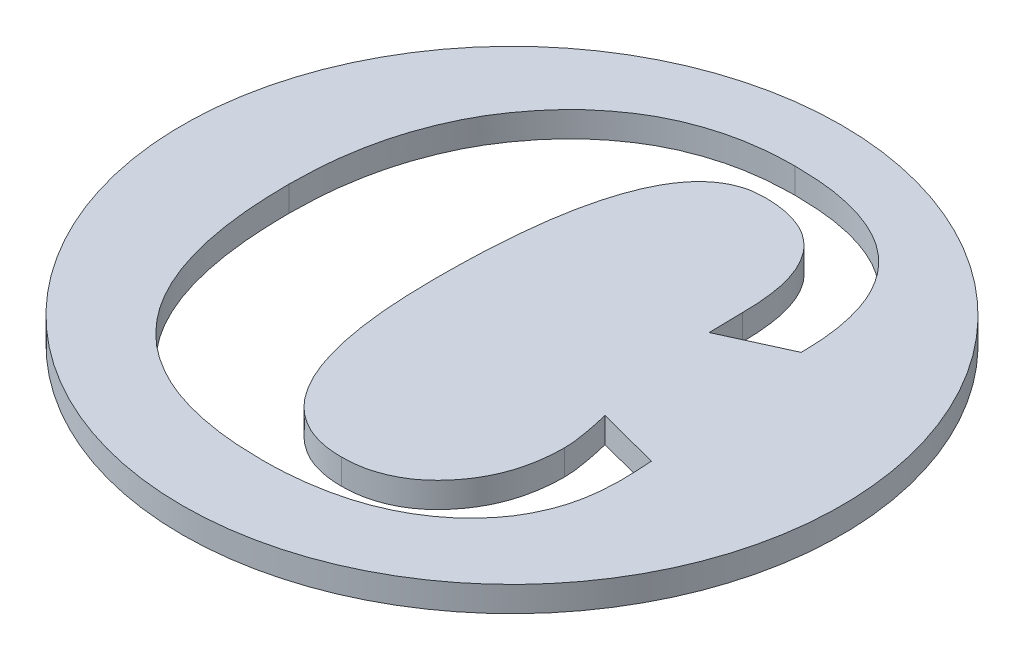
ISO-10303-21;
HEADER;
FILE_DESCRIPTION(('STEP AP214'),'2;1');
FILE_NAME('part.step','',(''),(''),'','','');
FILE_SCHEMA(('AUTOMOTIVE_DESIGN { 1 0 10303 214 1 1 1 1 }'));
ENDSEC;
DATA;
#1=APPLICATION_CONTEXT('core data for automotive mechanical design processes');
#2=APPLICATION_PROTOCOL_DEFINITION('international standard','automotive_design',2000,#1);
#3=PRODUCT_CONTEXT('',#1,'mechanical');
#4=PRODUCT('Part','Part','',(#3));
#5=PRODUCT_RELATED_PRODUCT_CATEGORY('part','',(#4));
#6=PRODUCT_DEFINITION_FORMATION('','',#4);
#7=PRODUCT_DEFINITION_CONTEXT('part definition',#1,'design');
#8=PRODUCT_DEFINITION('design','',#6,#7);
#9=PRODUCT_DEFINITION_SHAPE('','',#8);
#10=(LENGTH_UNIT() NAMED_UNIT(*) SI_UNIT(.MILLI.,.METRE.));
#11=(NAMED_UNIT(*) PLANE_ANGLE_UNIT() SI_UNIT($,.RADIAN.));
#12=(NAMED_UNIT(*) SI_UNIT($,.STERADIAN.) SOLID_ANGLE_UNIT());
#13=UNCERTAINTY_MEASURE_WITH_UNIT(LENGTH_MEASURE(1.E-05),#10,'distance_accuracy_value','');
#14=(GEOMETRIC_REPRESENTATION_CONTEXT(3) GLOBAL_UNCERTAINTY_ASSIGNED_CONTEXT((#13)) GLOBAL_UNIT_ASSIGNED_CONTEXT((#10,
#11,#12)) REPRESENTATION_CONTEXT('',''));
#15=CARTESIAN_POINT('',(0.,0.,0.));
#16=DIRECTION('',(0.,0.,1.));
#17=DIRECTION('',(1.,0.,0.));
#18=AXIS2_PLACEMENT_3D('',#15,#16,#17);
#19=CARTESIAN_POINT('',(0.,1.,0.));
#20=DIRECTION('',(0.,1.,0.));
#21=DIRECTION('',(0.,0.,1.));
#22=AXIS2_PLACEMENT_3D('',#19,#20,#21);
#23=PLANE('',#22);
#24=CARTESIAN_POINT('',(0.,1.,0.));
#25=DIRECTION('',(0.,1.,0.));
#26=DIRECTION('',(0.,0.,1.));
#27=AXIS2_PLACEMENT_3D('',#24,#25,#26);
#28=CIRCLE('',#27,13.);
#29=CARTESIAN_POINT('',(0.,1.,13.));
#30=VERTEX_POINT('',#29);
#31=EDGE_CURVE('E11',#30,#30,#28,.T.);
#32=ORIENTED_EDGE('',*,*,#31,.T.);
#33=EDGE_LOOP('',(#32));
#34=FACE_BOUND('',#33,.T.);
#35=CARTESIAN_POINT('',(1.476351583732,1.,8.20375611107367));
#36=CARTESIAN_POINT('',(1.61974551017424,1.,8.19917995660554));
#37=CARTESIAN_POINT('',(1.9020487574601,1.,8.19017076564127));
#38=CARTESIAN_POINT('',(2.31664097278782,1.,8.13115632994052));
#39=CARTESIAN_POINT('',(2.70988021241242,1.,8.0194669779392));
#40=CARTESIAN_POINT('',(3.08534632281107,1.,7.87167643885167));
#41=CARTESIAN_POINT('',(3.44425119432093,1.,7.68397991437655));
#42=CARTESIAN_POINT('',(3.78417604407388,1.,7.45318836241749));
#43=CARTESIAN_POINT('',(4.10274482596875,1.,7.1762131296289));
#44=CARTESIAN_POINT('',(4.39916024058578,1.,6.86090175100949));
#45=CARTESIAN_POINT('',(4.67131082176551,1.,6.51563360946859));
#46=CARTESIAN_POINT('',(4.91197305731182,1.,6.1463094007475));
#47=CARTESIAN_POINT('',(5.11132313200068,1.,5.75245186517567));
#48=CARTESIAN_POINT('',(5.27722941669169,1.,5.34048501519983));
#49=CARTESIAN_POINT('',(5.40292855332015,1.,4.90682129685313));
#50=CARTESIAN_POINT('',(5.49323947888048,1.,4.45383328502686));
#51=CARTESIAN_POINT('',(5.55227374370055,1.,3.9793255792857));
#52=CARTESIAN_POINT('',(5.55775813052687,1.,3.65532503641552));
#53=CARTESIAN_POINT('',(5.56055297262089,1.,3.49021444440701));
#54=B_SPLINE_CURVE_WITH_KNOTS('',3,(#35,#36,#37,#38,#39,#40,#41,#42,#43,#44,#45,#46,#47,#48,#49,
#50,#51,#52,#53),.UNSPECIFIED.,.F.,.F.,(4,1,1,1,1,1,1,1,1,1,1,1,1,1,1,1,4),(0.,
0.0617851155678099,0.121637918644697,0.179858723011441,0.237499434056786,0.29521087199379,
0.353989525029223,0.414091709118384,0.476701328925948,0.540170659932453,0.603274736539273,
0.666274065790541,0.730048715718103,0.794348143901258,0.860479406808787,0.928900342156493,1.),.UNSPECIFIED.);
#55=CARTESIAN_POINT('',(1.476351583732,1.,8.20375611107367));
#56=VERTEX_POINT('',#55);
#57=CARTESIAN_POINT('',(5.56055297262089,1.,3.49021444440701));
#58=VERTEX_POINT('',#57);
#59=EDGE_CURVE('E150',#56,#58,#54,.T.);
#60=ORIENTED_EDGE('',*,*,#59,.T.);
#61=CARTESIAN_POINT('',(5.56055297262089,1.,3.49021444440701));
#62=CARTESIAN_POINT('',(5.55709815481784,1.,3.36993002924337));
#63=CARTESIAN_POINT('',(5.54940400599004,1.,3.10204725084729));
#64=CARTESIAN_POINT('',(5.4792830655672,1.,2.66399498626251));
#65=CARTESIAN_POINT('',(5.3867625300742,1.,2.14790403311302));
#66=CARTESIAN_POINT('',(5.29925141659086,1.,1.78119062246025));
#67=CARTESIAN_POINT('',(5.25239325039867,1.,1.58483249996256));
#68=B_SPLINE_CURVE_WITH_KNOTS('',3,(#61,#62,#63,#64,#65,#66,#67),.UNSPECIFIED.,.F.,.F.,(4,1,1,1,
4),(0.,0.186495746762368,0.415340580355206,0.686941839029872,1.),.UNSPECIFIED.);
#69=CARTESIAN_POINT('',(5.25239325039867,1.,1.58483249996256));
#70=VERTEX_POINT('',#69);
#71=EDGE_CURVE('E60',#58,#70,#68,.T.);
#72=ORIENTED_EDGE('',*,*,#71,.T.);
#73=DIRECTION('',(0.967599274507933,0.,0.252490878987184));
#74=VECTOR('',#73,1.);
#75=CARTESIAN_POINT('',(5.25239325039867,1.,1.58483249996256));
#76=LINE('',#75,#74);
#77=CARTESIAN_POINT('',(7.73069186150978,1.,2.23153388885145));
#78=VERTEX_POINT('',#77);
#79=EDGE_CURVE('E156',#70,#78,#76,.T.);
#80=ORIENTED_EDGE('',*,*,#79,.T.);
#81=CARTESIAN_POINT('',(7.73069186150978,1.,2.23153388885145));
#82=CARTESIAN_POINT('',(7.74585490657577,1.,2.4658262893749));
#83=CARTESIAN_POINT('',(7.77401121265576,1.,2.9008845848985));
#84=CARTESIAN_POINT('',(7.78000790672506,1.,3.33679731153401));
#85=CARTESIAN_POINT('',(7.78277519484312,1.,3.53795749996256));
#86=B_SPLINE_CURVE_WITH_KNOTS('',3,(#81,#82,#83,#84,#85),.UNSPECIFIED.,.F.,.F.,(4,1,4),(0.,
0.538531049595257,1.),.UNSPECIFIED.);
#87=CARTESIAN_POINT('',(7.78277519484312,1.,3.53795749996256));
#88=VERTEX_POINT('',#87);
#89=EDGE_CURVE('E449',#78,#88,#86,.T.);
#90=ORIENTED_EDGE('',*,*,#89,.T.);
#91=CARTESIAN_POINT('',(7.78277519484312,1.,3.53795749996256));
#92=CARTESIAN_POINT('',(7.77573444059267,1.,3.77266628622254));
#93=CARTESIAN_POINT('',(7.76198387034077,1.,4.23105178575869));
#94=CARTESIAN_POINT('',(7.66510678884162,1.,4.90210786273724));
#95=CARTESIAN_POINT('',(7.50353480451613,1.,5.53719048035674));
#96=CARTESIAN_POINT('',(7.26250637559995,1.,6.13254791976599));
#97=CARTESIAN_POINT('',(6.97017174919938,1.,6.69734956114906));
#98=CARTESIAN_POINT('',(6.5999185256151,1.,7.22061254440377));
#99=CARTESIAN_POINT('',(6.1672949171714,1.,7.70906904669273));
#100=CARTESIAN_POINT('',(5.67348497863925,1.,8.15992995783578));
#101=CARTESIAN_POINT('',(5.12158984255351,1.,8.56126615780749));
#102=CARTESIAN_POINT('',(4.52533096122255,1.,8.91531599675034));
#103=CARTESIAN_POINT('',(3.88158818988202,1.,9.21066233173507));
#104=CARTESIAN_POINT('',(3.19477189575157,1.,9.45421056740481));
#105=CARTESIAN_POINT('',(2.46195738161705,1.,9.63922879305538));
#106=CARTESIAN_POINT('',(1.68571672581894,1.,9.77267979880114));
#107=CARTESIAN_POINT('',(0.864809488403498,1.,9.85751753878493));
#108=CARTESIAN_POINT('',(0.301796476434666,1.,9.86605419536471));
#109=CARTESIAN_POINT('',(0.0136779726208919,1.,9.87042277774034));
#110=B_SPLINE_CURVE_WITH_KNOTS('',3,(#91,#92,#93,#94,#95,#96,#97,#98,#99,#100,#101,#102,#103,
#104,#105,#106,#107,#108,#109),.UNSPECIFIED.,.F.,.F.,(4,1,1,1,1,1,1,1,1,1,1,1,1,1,1,1,4),(0.,
0.0623989737755393,0.121864993724444,0.179903958777674,0.236197963863891,0.292298398272552,
0.348650213583212,0.406157610571756,0.465522746645016,0.526080067762016,0.587308216080481,
0.649618181508208,0.714107337130903,0.780822094024443,0.850331226324203,0.923407910257143,1.),.UNSPECIFIED.);
#111=CARTESIAN_POINT('',(0.0136779726208919,1.,9.87042277774034));
#112=VERTEX_POINT('',#111);
#113=EDGE_CURVE('E304',#88,#112,#110,.T.);
#114=ORIENTED_EDGE('',*,*,#113,.T.);
#115=CARTESIAN_POINT('',(0.0136779726208919,1.,9.87042277774034));
#116=CARTESIAN_POINT('',(-0.345453387098413,1.,9.86340549300091));
#117=CARTESIAN_POINT('',(-1.04259134345381,1.,9.84978369303825));
#118=CARTESIAN_POINT('',(-2.05491348171566,1.,9.73080609763991));
#119=CARTESIAN_POINT('',(-2.99780830363982,1.,9.53736232386836));
#120=CARTESIAN_POINT('',(-3.87425124514682,1.,9.2705035916861));
#121=CARTESIAN_POINT('',(-4.67820190474734,1.,8.91731599317517));
#122=CARTESIAN_POINT('',(-5.41162835389207,1.,8.48501398991042));
#123=CARTESIAN_POINT('',(-6.08026275079366,1.,7.97918786646755));
#124=CARTESIAN_POINT('',(-6.67116569313639,1.,7.38627341142078));
#125=CARTESIAN_POINT('',(-7.20195736860133,1.,6.72419454862214));
#126=CARTESIAN_POINT('',(-7.65374203853512,1.,5.97838426978279));
#127=CARTESIAN_POINT('',(-8.03628823175623,1.,5.15719957824529));
#128=CARTESIAN_POINT('',(-8.34772327204242,1.,4.25802044729199));
#129=CARTESIAN_POINT('',(-8.5894361475008,1.,3.28160554009184));
#130=CARTESIAN_POINT('',(-8.76023183791302,1.,2.2277861781733));
#131=CARTESIAN_POINT('',(-8.865609008698,1.,1.09652957068112));
#132=CARTESIAN_POINT('',(-8.87767049071885,1.,0.316264727978851));
#133=CARTESIAN_POINT('',(-8.88389147182355,1.,-0.0861744444818815));
#134=B_SPLINE_CURVE_WITH_KNOTS('',3,(#115,#116,#117,#118,#119,#120,#121,#122,#123,#124,#125,
#126,#127,#128,#129,#130,#131,#132,#133),.UNSPECIFIED.,.F.,.F.,(4,1,1,1,1,1,1,1,1,1,1,1,1,1,1,1,
4),(0.,0.0703735105460199,0.136607522556516,0.199453052995705,0.258831225595281,
0.315841585200226,0.371139194359229,0.425361107476769,0.479702278503174,0.534795917390444,
0.59130971529807,0.650173734380533,0.71205603322384,0.777532348458583,0.847089228652433,
0.92113282450568,1.),.UNSPECIFIED.);
#135=CARTESIAN_POINT('',(-8.88389147182355,1.,-0.0861744444818815));
#136=VERTEX_POINT('',#135);
#137=EDGE_CURVE('E277',#112,#136,#134,.T.);
#138=ORIENTED_EDGE('',*,*,#137,.T.);
#139=CARTESIAN_POINT('',(-8.88389147182355,1.,-0.0861744444818815));
#140=CARTESIAN_POINT('',(-8.87714444826694,1.,-0.471355807025445));
#141=CARTESIAN_POINT('',(-8.86396985043572,1.,-1.22348146673479));
#142=CARTESIAN_POINT('',(-8.73906225821869,1.,-2.32376159340744));
#143=CARTESIAN_POINT('',(-8.53768384306321,1.,-3.36829728491427));
#144=CARTESIAN_POINT('',(-8.25053483974082,1.,-4.35750155846793));
#145=CARTESIAN_POINT('',(-7.88374944959827,1.,-5.29120772130511));
#146=CARTESIAN_POINT('',(-7.44376054657435,1.,-6.17371661319375));
#147=CARTESIAN_POINT('',(-6.9072499736024,1.,-6.99250141407337));
#148=CARTESIAN_POINT('',(-6.30319477587587,1.,-7.75403753336515));
#149=CARTESIAN_POINT('',(-5.63478291638699,1.,-8.44486956180196));
#150=CARTESIAN_POINT('',(-4.90394363101658,1.,-9.03984127423361));
#151=CARTESIAN_POINT('',(-4.13324793006135,1.,-9.55557000721924));
#152=CARTESIAN_POINT('',(-3.30549478144758,1.,-9.96904201738655));
#153=CARTESIAN_POINT('',(-2.4300734054477,1.,-10.2899490149016));
#154=CARTESIAN_POINT('',(-1.50673339218084,1.,-10.5220510811634));
#155=CARTESIAN_POINT('',(-0.534275430872519,1.,-10.6565894559998));
#156=CARTESIAN_POINT('',(0.130450491509705,1.,-10.6754933270898));
#157=CARTESIAN_POINT('',(0.469407139287559,1.,-10.6851327778152));
#158=B_SPLINE_CURVE_WITH_KNOTS('',3,(#139,#140,#141,#142,#143,#144,#145,#146,#147,#148,#149,
#150,#151,#152,#153,#154,#155,#156,#157),.UNSPECIFIED.,.F.,.F.,(4,1,1,1,1,1,1,1,1,1,1,1,1,1,1,1,
4),(0.,0.0727437462907932,0.14204331644552,0.208885226834343,0.273497230779173,
0.336331460640164,0.39818071815196,0.459435292462066,0.520901698785319,0.581591465620112,
0.640629058614215,0.698619802757939,0.756435090632918,0.814976488526295,0.874437711249095,
0.93597335225051,1.),.UNSPECIFIED.);
#159=CARTESIAN_POINT('',(0.469407139287559,1.,-10.6851327778152));
#160=VERTEX_POINT('',#159);
#161=EDGE_CURVE('E298',#136,#160,#158,.T.);
#162=ORIENTED_EDGE('',*,*,#161,.T.);
#163=CARTESIAN_POINT('',(0.469407139287559,1.,-10.6851327778152));
#164=CARTESIAN_POINT('',(0.731368092849475,1.,-10.6794038379688));
#165=CARTESIAN_POINT('',(1.24032138006633,1.,-10.6682733136389));
#166=CARTESIAN_POINT('',(1.98003141391286,1.,-10.6033765776968));
#167=CARTESIAN_POINT('',(2.66669613432011,1.,-10.4740002553959));
#168=CARTESIAN_POINT('',(3.30540925323153,1.,-10.3097948790739));
#169=CARTESIAN_POINT('',(3.88917370608367,1.,-10.0844430704016));
#170=CARTESIAN_POINT('',(4.42842721089028,1.,-9.82280470880295));
#171=CARTESIAN_POINT('',(4.91458631521047,1.,-9.50212723283302));
#172=CARTESIAN_POINT('',(5.34918139601946,1.,-9.13363315391463));
#173=CARTESIAN_POINT('',(5.73280703664738,1.,-8.71510281180936));
#174=CARTESIAN_POINT('',(6.0623919409979,1.,-8.24712483937377));
#175=CARTESIAN_POINT('',(6.34746987641313,1.,-7.73353644845617));
#176=CARTESIAN_POINT('',(6.57198450790892,1.,-7.16634116199518));
#177=CARTESIAN_POINT('',(6.74845361199093,1.,-6.55267860634565));
#178=CARTESIAN_POINT('',(6.87980413209269,1.,-5.89098287942699));
#179=CARTESIAN_POINT('',(6.9513963250631,1.,-5.18035406448809));
#180=CARTESIAN_POINT('',(6.96156493816125,1.,-4.69136174458433));
#181=CARTESIAN_POINT('',(6.96680297262089,1.,-4.43947305559299));
#182=B_SPLINE_CURVE_WITH_KNOTS('',3,(#163,#164,#165,#166,#167,#168,#169,#170,#171,#172,#173,
#174,#175,#176,#177,#178,#179,#180,#181),.UNSPECIFIED.,.F.,.F.,(4,1,1,1,1,1,1,1,1,1,1,1,1,1,1,1,
4),(0.,0.0760281420044085,0.147711986339933,0.215150695516178,0.278592692250528,
0.338784472070683,0.396423015134186,0.452196742851374,0.507294882137751,0.561374406115134,
0.61647254540151,0.673029194161318,0.731419625616101,0.793065190725774,0.858107975388799,
0.92690888056345,1.),.UNSPECIFIED.);
#183=CARTESIAN_POINT('',(6.96680297262089,1.,-4.43947305559299));
#184=VERTEX_POINT('',#183);
#185=EDGE_CURVE('E291',#160,#184,#182,.T.);
#186=ORIENTED_EDGE('',*,*,#185,.T.);
#187=DIRECTION('',(-0.909714034317323,0.,0.415235325768535));
#188=VECTOR('',#187,1.);
#189=CARTESIAN_POINT('',(6.96680297262089,1.,-4.43947305559299));
#190=LINE('',#189,#188);
#191=CARTESIAN_POINT('',(4.47548352817645,1.,-3.30232027781521));
#192=VERTEX_POINT('',#191);
#193=EDGE_CURVE('E297',#184,#192,#190,.T.);
#194=ORIENTED_EDGE('',*,*,#193,.T.);
#195=CARTESIAN_POINT('',(4.47548352817645,1.,-3.30232027781521));
#196=CARTESIAN_POINT('',(4.47010695179073,1.,-3.43829394401775));
#197=CARTESIAN_POINT('',(4.459927879974,1.,-3.69572276380275));
#198=CARTESIAN_POINT('',(4.46127664689068,1.,-4.05617003361408));
#199=CARTESIAN_POINT('',(4.44714290343167,1.,-4.36850647365915));
#200=CARTESIAN_POINT('',(4.44871535383197,1.,-4.55954312967595));
#201=CARTESIAN_POINT('',(4.44944186150978,1.,-4.64780638892633));
#202=B_SPLINE_CURVE_WITH_KNOTS('',3,(#195,#196,#197,#198,#199,#200,#201),.UNSPECIFIED.,.F.,.F.,
(4,1,1,1,4),(0.,0.303299990034831,0.574215292240264,0.803277827253538,1.),.UNSPECIFIED.);
#203=CARTESIAN_POINT('',(4.44944186150978,1.,-4.64780638892633));
#204=VERTEX_POINT('',#203);
#205=EDGE_CURVE('E322',#192,#204,#202,.T.);
#206=ORIENTED_EDGE('',*,*,#205,.T.);
#207=CARTESIAN_POINT('',(4.44944186150978,1.,-4.64780638892633));
#208=CARTESIAN_POINT('',(4.44772262283551,1.,-4.82444802567546));
#209=CARTESIAN_POINT('',(4.44439120088965,1.,-5.16673198777264));
#210=CARTESIAN_POINT('',(4.39666093289007,1.,-5.66173169544874));
#211=CARTESIAN_POINT('',(4.33746246316867,1.,-6.12593625774083));
#212=CARTESIAN_POINT('',(4.23476625315342,1.,-6.55264925446584));
#213=CARTESIAN_POINT('',(4.11517791793676,1.,-6.94906122059844));
#214=CARTESIAN_POINT('',(3.96437331318962,1.,-7.30869893311226));
#215=CARTESIAN_POINT('',(3.78380149201401,1.,-7.63357581985285));
#216=CARTESIAN_POINT('',(3.58075849632391,1.,-7.92760842416613));
#217=CARTESIAN_POINT('',(3.34464224335166,1.,-8.18494754593441));
#218=CARTESIAN_POINT('',(3.08087720941579,1.,-8.4072471675355));
#219=CARTESIAN_POINT('',(2.79409045538688,1.,-8.60265630077306));
#220=CARTESIAN_POINT('',(2.47264453642369,1.,-8.75121590690004));
#221=CARTESIAN_POINT('',(2.1296029962551,1.,-8.87634501463374));
#222=CARTESIAN_POINT('',(1.75544732373962,1.,-8.95501086174826));
#223=CARTESIAN_POINT('',(1.3564408329853,1.,-9.00963008294383));
#224=CARTESIAN_POINT('',(1.08014363353285,1.,-9.01546671937989));
#225=CARTESIAN_POINT('',(0.938157139287559,1.,-9.01846611114855));
#226=B_SPLINE_CURVE_WITH_KNOTS('',3,(#207,#208,#209,#210,#211,#212,#213,#214,#215,#216,#217,
#218,#219,#220,#221,#222,#223,#224,#225),.UNSPECIFIED.,.F.,.F.,(4,1,1,1,1,1,1,1,1,1,1,1,1,1,1,1,
4),(0.,0.082640455901403,0.160134967021523,0.23263077022362,0.301456649819439,0.365283863273637,
0.426282357066753,0.483570813151731,0.538991790620148,0.593153178552392,0.646478376382466,
0.700193424190971,0.755015418240262,0.811773116378229,0.870753559190315,0.933581487396119,1.),.UNSPECIFIED.);
#227=CARTESIAN_POINT('',(0.938157139287559,1.,-9.01846611114855));
#228=VERTEX_POINT('',#227);
#229=EDGE_CURVE('E328',#204,#228,#226,.T.);
#230=ORIENTED_EDGE('',*,*,#229,.T.);
#231=CARTESIAN_POINT('',(0.938157139287559,1.,-9.01846611114855));
#232=CARTESIAN_POINT('',(0.786942196127863,1.,-9.01267368166421));
#233=CARTESIAN_POINT('',(0.491913679154727,1.,-9.00137233905396));
#234=CARTESIAN_POINT('',(0.0644053175698157,1.,-8.88596345085515));
#235=CARTESIAN_POINT('',(-0.332873883244821,1.,-8.70398518281813));
#236=CARTESIAN_POINT('',(-0.699914649734606,1.,-8.4447011355967));
#237=CARTESIAN_POINT('',(-1.03632974297965,1.,-8.11491449353004));
#238=CARTESIAN_POINT('',(-1.33955244015641,1.,-7.71070614409247));
#239=CARTESIAN_POINT('',(-1.61291755329095,1.,-7.23590628214393));
#240=CARTESIAN_POINT('',(-1.86010983294428,1.,-6.69097094680381));
#241=CARTESIAN_POINT('',(-2.07407479662096,1.,-6.07092311255675));
#242=CARTESIAN_POINT('',(-2.2643959578668,1.,-5.38100179059882));
#243=CARTESIAN_POINT('',(-2.42300299642052,1.,-4.61972046733472));
#244=CARTESIAN_POINT('',(-2.55301875658315,1.,-3.7867717995561));
#245=CARTESIAN_POINT('',(-2.64933898807959,1.,-2.88126335488933));
#246=CARTESIAN_POINT('',(-2.72363513602551,1.,-1.90289272878824));
#247=CARTESIAN_POINT('',(-2.76672262091619,1.,-0.853348431692566));
#248=CARTESIAN_POINT('',(-2.77071900860245,1.,-0.129616857575528));
#249=CARTESIAN_POINT('',(-2.77278036071244,1.,0.243686666629229));
#250=B_SPLINE_CURVE_WITH_KNOTS('',3,(#231,#232,#233,#234,#235,#236,#237,#238,#239,#240,#241,
#242,#243,#244,#245,#246,#247,#248,#249),.UNSPECIFIED.,.F.,.F.,(4,1,1,1,1,1,1,1,1,1,1,1,1,1,1,1,
4),(0.,0.0414846630362758,0.080938817004329,0.120799807823618,0.161071381235725,
0.203821694428608,0.249798770917182,0.299526002644319,0.354165298577634,0.414039729669565,
0.479653235863514,0.550792175808231,0.62768726000104,0.711311729677756,0.801052899868468,
0.897382322030063,1.),.UNSPECIFIED.);
#251=CARTESIAN_POINT('',(-2.77278036071244,1.,0.243686666629229));
#252=VERTEX_POINT('',#251);
#253=EDGE_CURVE('E337',#228,#252,#250,.T.);
#254=ORIENTED_EDGE('',*,*,#253,.T.);
#255=CARTESIAN_POINT('',(-2.77278036071244,1.,0.243686666629229));
#256=CARTESIAN_POINT('',(-2.76923490772143,1.,0.564921798003715));
#257=CARTESIAN_POINT('',(-2.7623634866824,1.,1.18750566691976));
#258=CARTESIAN_POINT('',(-2.71575219882243,1.,2.08977385218027));
#259=CARTESIAN_POINT('',(-2.63433042201164,1.,2.9299578420185));
#260=CARTESIAN_POINT('',(-2.51878013474102,1.,3.70833990062915));
#261=CARTESIAN_POINT('',(-2.36719576508956,1.,4.42568234691635));
#262=CARTESIAN_POINT('',(-2.18616640974484,1.,5.08138104038713));
#263=CARTESIAN_POINT('',(-1.97753695720858,1.,5.67694519080182));
#264=CARTESIAN_POINT('',(-1.72195598277479,1.,6.20495827968991));
#265=CARTESIAN_POINT('',(-1.44292091696902,1.,6.67600247413522));
#266=CARTESIAN_POINT('',(-1.12801036180178,1.,7.08687998950643));
#267=CARTESIAN_POINT('',(-0.775787049027472,1.,7.43224592897431));
#268=CARTESIAN_POINT('',(-0.387635905027499,1.,7.71157805279948));
#269=CARTESIAN_POINT('',(0.0274643201125413,1.,7.94149635018268));
#270=CARTESIAN_POINT('',(0.4838739531805,1.,8.08632805435749));
#271=CARTESIAN_POINT('',(0.968240334249044,1.,8.18985694641954));
#272=CARTESIAN_POINT('',(1.30358628122679,1.,8.19903019054252));
#273=CARTESIAN_POINT('',(1.476351583732,1.,8.20375611107367));
#274=B_SPLINE_CURVE_WITH_KNOTS('',3,(#255,#256,#257,#258,#259,#260,#261,#262,#263,#264,#265,
#266,#267,#268,#269,#270,#271,#272,#273),.UNSPECIFIED.,.F.,.F.,(4,1,1,1,1,1,1,1,1,1,1,1,1,1,1,1,
4),(0.,0.095540818616124,0.185167083808434,0.26861532068226,0.346509269192505,0.419087542840383,
0.486528524424942,0.548730971418735,0.606469014644689,0.660708277800895,0.711316803625382,
0.760002838953964,0.806823910599885,0.853219923207003,0.90043674779268,0.948706475980931,1.),.UNSPECIFIED.);
#275=EDGE_CURVE('E346',#252,#56,#274,.T.);
#276=ORIENTED_EDGE('',*,*,#275,.T.);
#277=EDGE_LOOP('',(#60,#72,#80,#90,#114,#138,#162,#186,#194,#206,#230,#254,#276));
#278=FACE_BOUND('',#277,.T.);
#279=ADVANCED_FACE('F44',(#34,#278),#23,.T.);
#280=CARTESIAN_POINT('',(0.,0.,0.));
#281=DIRECTION('',(0.,1.,0.));
#282=DIRECTION('',(0.,0.,1.));
#283=AXIS2_PLACEMENT_3D('',#280,#281,#282);
#284=PLANE('',#283);
#285=CARTESIAN_POINT('',(0.,0.,0.));
#286=DIRECTION('',(0.,1.,0.));
#287=DIRECTION('',(0.,0.,1.));
#288=AXIS2_PLACEMENT_3D('',#285,#286,#287);
#289=CIRCLE('',#288,13.);
#290=CARTESIAN_POINT('',(0.,0.,13.));
#291=VERTEX_POINT('',#290);
#292=EDGE_CURVE('E48',#291,#291,#289,.T.);
#293=ORIENTED_EDGE('',*,*,#292,.F.);
#294=EDGE_LOOP('',(#293));
#295=FACE_BOUND('',#294,.T.);
#296=CARTESIAN_POINT('',(5.56055297262089,0.,3.49021444440701));
#297=CARTESIAN_POINT('',(5.55709815481784,0.,3.36993002924337));
#298=CARTESIAN_POINT('',(5.54940400599004,0.,3.10204725084729));
#299=CARTESIAN_POINT('',(5.4792830655672,0.,2.66399498626251));
#300=CARTESIAN_POINT('',(5.3867625300742,0.,2.14790403311302));
#301=CARTESIAN_POINT('',(5.29925141659086,0.,1.78119062246025));
#302=CARTESIAN_POINT('',(5.25239325039867,0.,1.58483249996256));
#303=B_SPLINE_CURVE_WITH_KNOTS('',3,(#296,#297,#298,#299,#300,#301,#302),.UNSPECIFIED.,.F.,.F.,
(4,1,1,1,4),(0.,0.186495746762368,0.415340580355206,0.686941839029872,1.),.UNSPECIFIED.);
#304=CARTESIAN_POINT('',(5.56055297262089,0.,3.49021444440701));
#305=VERTEX_POINT('',#304);
#306=CARTESIAN_POINT('',(5.25239325039867,0.,1.58483249996256));
#307=VERTEX_POINT('',#306);
#308=EDGE_CURVE('E140',#305,#307,#303,.T.);
#309=ORIENTED_EDGE('',*,*,#308,.F.);
#310=CARTESIAN_POINT('',(1.476351583732,0.,8.20375611107367));
#311=CARTESIAN_POINT('',(1.61974551017424,0.,8.19917995660554));
#312=CARTESIAN_POINT('',(1.9020487574601,0.,8.19017076564127));
#313=CARTESIAN_POINT('',(2.31664097278782,0.,8.13115632994052));
#314=CARTESIAN_POINT('',(2.70988021241242,0.,8.0194669779392));
#315=CARTESIAN_POINT('',(3.08534632281107,0.,7.87167643885167));
#316=CARTESIAN_POINT('',(3.44425119432093,0.,7.68397991437655));
#317=CARTESIAN_POINT('',(3.78417604407388,0.,7.45318836241749));
#318=CARTESIAN_POINT('',(4.10274482596875,0.,7.1762131296289));
#319=CARTESIAN_POINT('',(4.39916024058578,0.,6.86090175100949));
#320=CARTESIAN_POINT('',(4.67131082176551,0.,6.51563360946859));
#321=CARTESIAN_POINT('',(4.91197305731182,0.,6.1463094007475));
#322=CARTESIAN_POINT('',(5.11132313200068,0.,5.75245186517567));
#323=CARTESIAN_POINT('',(5.27722941669169,0.,5.34048501519983));
#324=CARTESIAN_POINT('',(5.40292855332015,0.,4.90682129685313));
#325=CARTESIAN_POINT('',(5.49323947888048,0.,4.45383328502686));
#326=CARTESIAN_POINT('',(5.55227374370055,0.,3.9793255792857));
#327=CARTESIAN_POINT('',(5.55775813052687,0.,3.65532503641552));
#328=CARTESIAN_POINT('',(5.56055297262089,0.,3.49021444440701));
#329=B_SPLINE_CURVE_WITH_KNOTS('',3,(#310,#311,#312,#313,#314,#315,#316,#317,#318,#319,#320,
#321,#322,#323,#324,#325,#326,#327,#328),.UNSPECIFIED.,.F.,.F.,(4,1,1,1,1,1,1,1,1,1,1,1,1,1,1,1,
4),(0.,0.0617851155678099,0.121637918644697,0.179858723011441,0.237499434056786,
0.29521087199379,0.353989525029223,0.414091709118384,0.476701328925948,0.540170659932453,
0.603274736539273,0.666274065790541,0.730048715718103,0.794348143901258,0.860479406808787,
0.928900342156493,1.),.UNSPECIFIED.);
#330=CARTESIAN_POINT('',(1.476351583732,0.,8.20375611107367));
#331=VERTEX_POINT('',#330);
#332=EDGE_CURVE('E240',#331,#305,#329,.T.);
#333=ORIENTED_EDGE('',*,*,#332,.F.);
#334=CARTESIAN_POINT('',(-2.77278036071244,0.,0.243686666629229));
#335=CARTESIAN_POINT('',(-2.76923490772143,0.,0.564921798003715));
#336=CARTESIAN_POINT('',(-2.7623634866824,0.,1.18750566691976));
#337=CARTESIAN_POINT('',(-2.71575219882243,0.,2.08977385218027));
#338=CARTESIAN_POINT('',(-2.63433042201164,0.,2.9299578420185));
#339=CARTESIAN_POINT('',(-2.51878013474102,0.,3.70833990062915));
#340=CARTESIAN_POINT('',(-2.36719576508956,0.,4.42568234691635));
#341=CARTESIAN_POINT('',(-2.18616640974484,0.,5.08138104038713));
#342=CARTESIAN_POINT('',(-1.97753695720858,0.,5.67694519080182));
#343=CARTESIAN_POINT('',(-1.72195598277479,0.,6.20495827968991));
#344=CARTESIAN_POINT('',(-1.44292091696902,0.,6.67600247413522));
#345=CARTESIAN_POINT('',(-1.12801036180178,0.,7.08687998950643));
#346=CARTESIAN_POINT('',(-0.775787049027472,0.,7.43224592897431));
#347=CARTESIAN_POINT('',(-0.387635905027499,0.,7.71157805279948));
#348=CARTESIAN_POINT('',(0.0274643201125413,0.,7.94149635018268));
#349=CARTESIAN_POINT('',(0.4838739531805,0.,8.08632805435749));
#350=CARTESIAN_POINT('',(0.968240334249044,0.,8.18985694641954));
#351=CARTESIAN_POINT('',(1.30358628122679,0.,8.19903019054252));
#352=CARTESIAN_POINT('',(1.476351583732,0.,8.20375611107367));
#353=B_SPLINE_CURVE_WITH_KNOTS('',3,(#334,#335,#336,#337,#338,#339,#340,#341,#342,#343,#344,
#345,#346,#347,#348,#349,#350,#351,#352),.UNSPECIFIED.,.F.,.F.,(4,1,1,1,1,1,1,1,1,1,1,1,1,1,1,1,
4),(0.,0.095540818616124,0.185167083808434,0.26861532068226,0.346509269192505,0.419087542840383,
0.486528524424942,0.548730971418735,0.606469014644689,0.660708277800895,0.711316803625382,
0.760002838953964,0.806823910599885,0.853219923207003,0.90043674779268,0.948706475980931,1.),.UNSPECIFIED.);
#354=CARTESIAN_POINT('',(-2.77278036071244,0.,0.243686666629229));
#355=VERTEX_POINT('',#354);
#356=EDGE_CURVE('E243',#355,#331,#353,.T.);
#357=ORIENTED_EDGE('',*,*,#356,.F.);
#358=CARTESIAN_POINT('',(0.938157139287559,0.,-9.01846611114855));
#359=CARTESIAN_POINT('',(0.786942196127863,0.,-9.01267368166421));
#360=CARTESIAN_POINT('',(0.491913679154727,0.,-9.00137233905396));
#361=CARTESIAN_POINT('',(0.0644053175698157,0.,-8.88596345085515));
#362=CARTESIAN_POINT('',(-0.332873883244821,0.,-8.70398518281813));
#363=CARTESIAN_POINT('',(-0.699914649734606,0.,-8.4447011355967));
#364=CARTESIAN_POINT('',(-1.03632974297965,0.,-8.11491449353004));
#365=CARTESIAN_POINT('',(-1.33955244015641,0.,-7.71070614409247));
#366=CARTESIAN_POINT('',(-1.61291755329095,0.,-7.23590628214393));
#367=CARTESIAN_POINT('',(-1.86010983294428,0.,-6.69097094680381));
#368=CARTESIAN_POINT('',(-2.07407479662096,0.,-6.07092311255675));
#369=CARTESIAN_POINT('',(-2.2643959578668,0.,-5.38100179059882));
#370=CARTESIAN_POINT('',(-2.42300299642052,0.,-4.61972046733472));
#371=CARTESIAN_POINT('',(-2.55301875658315,0.,-3.7867717995561));
#372=CARTESIAN_POINT('',(-2.64933898807959,0.,-2.88126335488933));
#373=CARTESIAN_POINT('',(-2.72363513602551,0.,-1.90289272878824));
#374=CARTESIAN_POINT('',(-2.76672262091619,0.,-0.853348431692566));
#375=CARTESIAN_POINT('',(-2.77071900860245,0.,-0.129616857575528));
#376=CARTESIAN_POINT('',(-2.77278036071244,0.,0.243686666629229));
#377=B_SPLINE_CURVE_WITH_KNOTS('',3,(#358,#359,#360,#361,#362,#363,#364,#365,#366,#367,#368,
#369,#370,#371,#372,#373,#374,#375,#376),.UNSPECIFIED.,.F.,.F.,(4,1,1,1,1,1,1,1,1,1,1,1,1,1,1,1,
4),(0.,0.0414846630362758,0.080938817004329,0.120799807823618,0.161071381235725,
0.203821694428608,0.249798770917182,0.299526002644319,0.354165298577634,0.414039729669565,
0.479653235863514,0.550792175808231,0.62768726000104,0.711311729677756,0.801052899868468,
0.897382322030063,1.),.UNSPECIFIED.);
#378=CARTESIAN_POINT('',(0.938157139287559,0.,-9.01846611114855));
#379=VERTEX_POINT('',#378);
#380=EDGE_CURVE('E246',#379,#355,#377,.T.);
#381=ORIENTED_EDGE('',*,*,#380,.F.);
#382=CARTESIAN_POINT('',(4.44944186150978,0.,-4.64780638892633));
#383=CARTESIAN_POINT('',(4.44772262283551,0.,-4.82444802567546));
#384=CARTESIAN_POINT('',(4.44439120088965,0.,-5.16673198777264));
#385=CARTESIAN_POINT('',(4.39666093289007,0.,-5.66173169544874));
#386=CARTESIAN_POINT('',(4.33746246316867,0.,-6.12593625774083));
#387=CARTESIAN_POINT('',(4.23476625315342,0.,-6.55264925446584));
#388=CARTESIAN_POINT('',(4.11517791793676,0.,-6.94906122059844));
#389=CARTESIAN_POINT('',(3.96437331318962,0.,-7.30869893311226));
#390=CARTESIAN_POINT('',(3.78380149201401,0.,-7.63357581985285));
#391=CARTESIAN_POINT('',(3.58075849632391,0.,-7.92760842416613));
#392=CARTESIAN_POINT('',(3.34464224335166,0.,-8.18494754593441));
#393=CARTESIAN_POINT('',(3.08087720941579,0.,-8.4072471675355));
#394=CARTESIAN_POINT('',(2.79409045538688,0.,-8.60265630077306));
#395=CARTESIAN_POINT('',(2.47264453642369,0.,-8.75121590690004));
#396=CARTESIAN_POINT('',(2.1296029962551,0.,-8.87634501463374));
#397=CARTESIAN_POINT('',(1.75544732373962,0.,-8.95501086174826));
#398=CARTESIAN_POINT('',(1.3564408329853,0.,-9.00963008294383));
#399=CARTESIAN_POINT('',(1.08014363353285,0.,-9.01546671937989));
#400=CARTESIAN_POINT('',(0.938157139287559,0.,-9.01846611114855));
#401=B_SPLINE_CURVE_WITH_KNOTS('',3,(#382,#383,#384,#385,#386,#387,#388,#389,#390,#391,#392,
#393,#394,#395,#396,#397,#398,#399,#400),.UNSPECIFIED.,.F.,.F.,(4,1,1,1,1,1,1,1,1,1,1,1,1,1,1,1,
4),(0.,0.082640455901403,0.160134967021523,0.23263077022362,0.301456649819439,0.365283863273637,
0.426282357066753,0.483570813151731,0.538991790620148,0.593153178552392,0.646478376382466,
0.700193424190971,0.755015418240262,0.811773116378229,0.870753559190315,0.933581487396119,1.),.UNSPECIFIED.);
#402=CARTESIAN_POINT('',(4.44944186150978,0.,-4.64780638892633));
#403=VERTEX_POINT('',#402);
#404=EDGE_CURVE('E249',#403,#379,#401,.T.);
#405=ORIENTED_EDGE('',*,*,#404,.F.);
#406=CARTESIAN_POINT('',(4.47548352817645,0.,-3.30232027781521));
#407=CARTESIAN_POINT('',(4.47010695179073,0.,-3.43829394401775));
#408=CARTESIAN_POINT('',(4.459927879974,0.,-3.69572276380275));
#409=CARTESIAN_POINT('',(4.46127664689068,0.,-4.05617003361408));
#410=CARTESIAN_POINT('',(4.44714290343167,0.,-4.36850647365915));
#411=CARTESIAN_POINT('',(4.44871535383197,0.,-4.55954312967595));
#412=CARTESIAN_POINT('',(4.44944186150978,0.,-4.64780638892633));
#413=B_SPLINE_CURVE_WITH_KNOTS('',3,(#406,#407,#408,#409,#410,#411,#412),.UNSPECIFIED.,.F.,.F.,
(4,1,1,1,4),(0.,0.303299990034831,0.574215292240264,0.803277827253538,1.),.UNSPECIFIED.);
#414=CARTESIAN_POINT('',(4.47548352817645,0.,-3.30232027781521));
#415=VERTEX_POINT('',#414);
#416=EDGE_CURVE('E252',#415,#403,#413,.T.);
#417=ORIENTED_EDGE('',*,*,#416,.F.);
#418=DIRECTION('',(-0.909714034317323,0.,0.415235325768535));
#419=VECTOR('',#418,1.);
#420=CARTESIAN_POINT('',(6.96680297262089,0.,-4.43947305559299));
#421=LINE('',#420,#419);
#422=CARTESIAN_POINT('',(6.96680297262089,0.,-4.43947305559299));
#423=VERTEX_POINT('',#422);
#424=EDGE_CURVE('E255',#423,#415,#421,.T.);
#425=ORIENTED_EDGE('',*,*,#424,.F.);
#426=CARTESIAN_POINT('',(0.469407139287559,0.,-10.6851327778152));
#427=CARTESIAN_POINT('',(0.731368092849475,0.,-10.6794038379688));
#428=CARTESIAN_POINT('',(1.24032138006633,0.,-10.6682733136389));
#429=CARTESIAN_POINT('',(1.98003141391286,0.,-10.6033765776968));
#430=CARTESIAN_POINT('',(2.66669613432011,0.,-10.4740002553959));
#431=CARTESIAN_POINT('',(3.30540925323153,0.,-10.3097948790739));
#432=CARTESIAN_POINT('',(3.88917370608367,0.,-10.0844430704016));
#433=CARTESIAN_POINT('',(4.42842721089028,0.,-9.82280470880295));
#434=CARTESIAN_POINT('',(4.91458631521047,0.,-9.50212723283302));
#435=CARTESIAN_POINT('',(5.34918139601946,0.,-9.13363315391463));
#436=CARTESIAN_POINT('',(5.73280703664738,0.,-8.71510281180936));
#437=CARTESIAN_POINT('',(6.0623919409979,0.,-8.24712483937377));
#438=CARTESIAN_POINT('',(6.34746987641313,0.,-7.73353644845617));
#439=CARTESIAN_POINT('',(6.57198450790892,0.,-7.16634116199518));
#440=CARTESIAN_POINT('',(6.74845361199093,0.,-6.55267860634565));
#441=CARTESIAN_POINT('',(6.87980413209269,0.,-5.89098287942699));
#442=CARTESIAN_POINT('',(6.9513963250631,0.,-5.18035406448809));
#443=CARTESIAN_POINT('',(6.96156493816125,0.,-4.69136174458433));
#444=CARTESIAN_POINT('',(6.96680297262089,0.,-4.43947305559299));
#445=B_SPLINE_CURVE_WITH_KNOTS('',3,(#426,#427,#428,#429,#430,#431,#432,#433,#434,#435,#436,
#437,#438,#439,#440,#441,#442,#443,#444),.UNSPECIFIED.,.F.,.F.,(4,1,1,1,1,1,1,1,1,1,1,1,1,1,1,1,
4),(0.,0.0760281420044085,0.147711986339933,0.215150695516178,0.278592692250528,
0.338784472070683,0.396423015134186,0.452196742851374,0.507294882137751,0.561374406115134,
0.61647254540151,0.673029194161318,0.731419625616101,0.793065190725774,0.858107975388799,
0.92690888056345,1.),.UNSPECIFIED.);
#446=CARTESIAN_POINT('',(0.469407139287559,0.,-10.6851327778152));
#447=VERTEX_POINT('',#446);
#448=EDGE_CURVE('E258',#447,#423,#445,.T.);
#449=ORIENTED_EDGE('',*,*,#448,.F.);
#450=CARTESIAN_POINT('',(-8.88389147182355,0.,-0.0861744444818815));
#451=CARTESIAN_POINT('',(-8.87714444826694,0.,-0.471355807025445));
#452=CARTESIAN_POINT('',(-8.86396985043572,0.,-1.22348146673479));
#453=CARTESIAN_POINT('',(-8.73906225821869,0.,-2.32376159340744));
#454=CARTESIAN_POINT('',(-8.53768384306321,0.,-3.36829728491427));
#455=CARTESIAN_POINT('',(-8.25053483974082,0.,-4.35750155846793));
#456=CARTESIAN_POINT('',(-7.88374944959827,0.,-5.29120772130511));
#457=CARTESIAN_POINT('',(-7.44376054657435,0.,-6.17371661319375));
#458=CARTESIAN_POINT('',(-6.9072499736024,0.,-6.99250141407337));
#459=CARTESIAN_POINT('',(-6.30319477587587,0.,-7.75403753336515));
#460=CARTESIAN_POINT('',(-5.63478291638699,0.,-8.44486956180196));
#461=CARTESIAN_POINT('',(-4.90394363101658,0.,-9.03984127423361));
#462=CARTESIAN_POINT('',(-4.13324793006135,0.,-9.55557000721924));
#463=CARTESIAN_POINT('',(-3.30549478144758,0.,-9.96904201738655));
#464=CARTESIAN_POINT('',(-2.4300734054477,0.,-10.2899490149016));
#465=CARTESIAN_POINT('',(-1.50673339218084,0.,-10.5220510811634));
#466=CARTESIAN_POINT('',(-0.534275430872519,0.,-10.6565894559998));
#467=CARTESIAN_POINT('',(0.130450491509705,0.,-10.6754933270898));
#468=CARTESIAN_POINT('',(0.469407139287559,0.,-10.6851327778152));
#469=B_SPLINE_CURVE_WITH_KNOTS('',3,(#450,#451,#452,#453,#454,#455,#456,#457,#458,#459,#460,
#461,#462,#463,#464,#465,#466,#467,#468),.UNSPECIFIED.,.F.,.F.,(4,1,1,1,1,1,1,1,1,1,1,1,1,1,1,1,
4),(0.,0.0727437462907932,0.14204331644552,0.208885226834343,0.273497230779173,
0.336331460640164,0.39818071815196,0.459435292462066,0.520901698785319,0.581591465620112,
0.640629058614215,0.698619802757939,0.756435090632918,0.814976488526295,0.874437711249095,
0.93597335225051,1.),.UNSPECIFIED.);
#470=CARTESIAN_POINT('',(-8.88389147182355,0.,-0.0861744444818815));
#471=VERTEX_POINT('',#470);
#472=EDGE_CURVE('E261',#471,#447,#469,.T.);
#473=ORIENTED_EDGE('',*,*,#472,.F.);
#474=CARTESIAN_POINT('',(0.0136779726208919,0.,9.87042277774034));
#475=CARTESIAN_POINT('',(-0.345453387098413,0.,9.86340549300091));
#476=CARTESIAN_POINT('',(-1.04259134345381,0.,9.84978369303825));
#477=CARTESIAN_POINT('',(-2.05491348171566,0.,9.73080609763991));
#478=CARTESIAN_POINT('',(-2.99780830363982,0.,9.53736232386836));
#479=CARTESIAN_POINT('',(-3.87425124514682,0.,9.2705035916861));
#480=CARTESIAN_POINT('',(-4.67820190474734,0.,8.91731599317517));
#481=CARTESIAN_POINT('',(-5.41162835389207,0.,8.48501398991042));
#482=CARTESIAN_POINT('',(-6.08026275079366,0.,7.97918786646755));
#483=CARTESIAN_POINT('',(-6.67116569313639,0.,7.38627341142078));
#484=CARTESIAN_POINT('',(-7.20195736860133,0.,6.72419454862214));
#485=CARTESIAN_POINT('',(-7.65374203853512,0.,5.97838426978279));
#486=CARTESIAN_POINT('',(-8.03628823175623,0.,5.15719957824529));
#487=CARTESIAN_POINT('',(-8.34772327204242,0.,4.25802044729199));
#488=CARTESIAN_POINT('',(-8.5894361475008,0.,3.28160554009184));
#489=CARTESIAN_POINT('',(-8.76023183791302,0.,2.2277861781733));
#490=CARTESIAN_POINT('',(-8.865609008698,0.,1.09652957068112));
#491=CARTESIAN_POINT('',(-8.87767049071885,0.,0.316264727978851));
#492=CARTESIAN_POINT('',(-8.88389147182355,0.,-0.0861744444818815));
#493=B_SPLINE_CURVE_WITH_KNOTS('',3,(#474,#475,#476,#477,#478,#479,#480,#481,#482,#483,#484,
#485,#486,#487,#488,#489,#490,#491,#492),.UNSPECIFIED.,.F.,.F.,(4,1,1,1,1,1,1,1,1,1,1,1,1,1,1,1,
4),(0.,0.0703735105460199,0.136607522556516,0.199453052995705,0.258831225595281,
0.315841585200226,0.371139194359229,0.425361107476769,0.479702278503174,0.534795917390444,
0.59130971529807,0.650173734380533,0.71205603322384,0.777532348458583,0.847089228652433,
0.92113282450568,1.),.UNSPECIFIED.);
#494=CARTESIAN_POINT('',(0.0136779726208919,0.,9.87042277774034));
#495=VERTEX_POINT('',#494);
#496=EDGE_CURVE('E264',#495,#471,#493,.T.);
#497=ORIENTED_EDGE('',*,*,#496,.F.);
#498=CARTESIAN_POINT('',(7.78277519484312,0.,3.53795749996256));
#499=CARTESIAN_POINT('',(7.77573444059267,0.,3.77266628622254));
#500=CARTESIAN_POINT('',(7.76198387034077,0.,4.23105178575869));
#501=CARTESIAN_POINT('',(7.66510678884162,0.,4.90210786273724));
#502=CARTESIAN_POINT('',(7.50353480451613,0.,5.53719048035674));
#503=CARTESIAN_POINT('',(7.26250637559995,0.,6.13254791976599));
#504=CARTESIAN_POINT('',(6.97017174919938,0.,6.69734956114906));
#505=CARTESIAN_POINT('',(6.5999185256151,0.,7.22061254440377));
#506=CARTESIAN_POINT('',(6.1672949171714,0.,7.70906904669273));
#507=CARTESIAN_POINT('',(5.67348497863925,0.,8.15992995783578));
#508=CARTESIAN_POINT('',(5.12158984255351,0.,8.56126615780749));
#509=CARTESIAN_POINT('',(4.52533096122255,0.,8.91531599675034));
#510=CARTESIAN_POINT('',(3.88158818988202,0.,9.21066233173507));
#511=CARTESIAN_POINT('',(3.19477189575157,0.,9.45421056740481));
#512=CARTESIAN_POINT('',(2.46195738161705,0.,9.63922879305538));
#513=CARTESIAN_POINT('',(1.68571672581894,0.,9.77267979880114));
#514=CARTESIAN_POINT('',(0.864809488403498,0.,9.85751753878493));
#515=CARTESIAN_POINT('',(0.301796476434666,0.,9.86605419536471));
#516=CARTESIAN_POINT('',(0.0136779726208919,0.,9.87042277774034));
#517=B_SPLINE_CURVE_WITH_KNOTS('',3,(#498,#499,#500,#501,#502,#503,#504,#505,#506,#507,#508,
#509,#510,#511,#512,#513,#514,#515,#516),.UNSPECIFIED.,.F.,.F.,(4,1,1,1,1,1,1,1,1,1,1,1,1,1,1,1,
4),(0.,0.0623989737755393,0.121864993724444,0.179903958777674,0.236197963863891,
0.292298398272552,0.348650213583212,0.406157610571756,0.465522746645016,0.526080067762016,
0.587308216080481,0.649618181508208,0.714107337130903,0.780822094024443,0.850331226324203,
0.923407910257143,1.),.UNSPECIFIED.);
#518=CARTESIAN_POINT('',(7.78277519484312,0.,3.53795749996256));
#519=VERTEX_POINT('',#518);
#520=EDGE_CURVE('E167',#519,#495,#517,.T.);
#521=ORIENTED_EDGE('',*,*,#520,.F.);
#522=CARTESIAN_POINT('',(7.73069186150978,0.,2.23153388885145));
#523=CARTESIAN_POINT('',(7.74585490657577,0.,2.4658262893749));
#524=CARTESIAN_POINT('',(7.77401121265576,0.,2.9008845848985));
#525=CARTESIAN_POINT('',(7.78000790672506,0.,3.33679731153401));
#526=CARTESIAN_POINT('',(7.78277519484312,0.,3.53795749996256));
#527=B_SPLINE_CURVE_WITH_KNOTS('',3,(#522,#523,#524,#525,#526),.UNSPECIFIED.,.F.,.F.,(4,1,4),
(0.,0.538531049595257,1.),.UNSPECIFIED.);
#528=CARTESIAN_POINT('',(7.73069186150978,0.,2.23153388885145));
#529=VERTEX_POINT('',#528);
#530=EDGE_CURVE('E163',#529,#519,#527,.T.);
#531=ORIENTED_EDGE('',*,*,#530,.F.);
#532=DIRECTION('',(0.967599274507933,0.,0.252490878987184));
#533=VECTOR('',#532,1.);
#534=CARTESIAN_POINT('',(5.25239325039867,0.,1.58483249996256));
#535=LINE('',#534,#533);
#536=EDGE_CURVE('E149',#307,#529,#535,.T.);
#537=ORIENTED_EDGE('',*,*,#536,.F.);
#538=EDGE_LOOP('',(#309,#333,#357,#381,#405,#417,#425,#449,#473,#497,#521,#531,#537));
#539=FACE_BOUND('',#538,.T.);
#540=ADVANCED_FACE('F161',(#295,#539),#284,.F.);
#541=CARTESIAN_POINT('',(0.,1.,0.));
#542=DIRECTION('',(0.,-1.,0.));
#543=DIRECTION('',(0.,0.,-1.));
#544=AXIS2_PLACEMENT_3D('',#541,#542,#543);
#545=CYLINDRICAL_SURFACE('',#544,13.);
#546=ORIENTED_EDGE('',*,*,#31,.F.);
#547=EDGE_LOOP('',(#546));
#548=FACE_BOUND('',#547,.T.);
#549=ORIENTED_EDGE('',*,*,#292,.T.);
#550=EDGE_LOOP('',(#549));
#551=FACE_BOUND('',#550,.T.);
#552=ADVANCED_FACE('F46',(#548,#551),#545,.T.);
#553=DIRECTION('',(0.,1.,0.));
#554=VECTOR('',#553,1.);
#555=SURFACE_OF_LINEAR_EXTRUSION('',#303,#554);
#556=ORIENTED_EDGE('',*,*,#71,.F.);
#557=DIRECTION('',(0.,1.,0.));
#558=VECTOR('',#557,1.);
#559=CARTESIAN_POINT('',(5.56055297262089,0.,3.49021444440701));
#560=LINE('',#559,#558);
#561=EDGE_CURVE('E144',#305,#58,#560,.T.);
#562=ORIENTED_EDGE('',*,*,#561,.F.);
#563=ORIENTED_EDGE('',*,*,#308,.T.);
#564=DIRECTION('',(0.,1.,0.));
#565=VECTOR('',#564,1.);
#566=CARTESIAN_POINT('',(5.25239325039867,0.,1.58483249996256));
#567=LINE('',#566,#565);
#568=EDGE_CURVE('E143',#307,#70,#567,.T.);
#569=ORIENTED_EDGE('',*,*,#568,.T.);
#570=EDGE_LOOP('',(#556,#562,#563,#569));
#571=FACE_BOUND('',#570,.T.);
#572=ADVANCED_FACE('F142',(#571),#555,.T.);
#573=CARTESIAN_POINT('',(5.25239325039867,0.,1.58483249996256));
#574=DIRECTION('',(-0.252490878987184,0.,0.967599274507933));
#575=DIRECTION('',(0.967599274507934,0.,0.252490878987184));
#576=AXIS2_PLACEMENT_3D('',#573,#574,#575);
#577=PLANE('',#576);
#578=ORIENTED_EDGE('',*,*,#79,.F.);
#579=ORIENTED_EDGE('',*,*,#568,.F.);
#580=ORIENTED_EDGE('',*,*,#536,.T.);
#581=DIRECTION('',(0.,1.,0.));
#582=VECTOR('',#581,1.);
#583=CARTESIAN_POINT('',(7.73069186150978,0.,2.23153388885145));
#584=LINE('',#583,#582);
#585=EDGE_CURVE('E158',#529,#78,#584,.T.);
#586=ORIENTED_EDGE('',*,*,#585,.T.);
#587=EDGE_LOOP('',(#578,#579,#580,#586));
#588=FACE_BOUND('',#587,.T.);
#589=ADVANCED_FACE('F153',(#588),#577,.T.);
#590=DIRECTION('',(0.,1.,0.));
#591=VECTOR('',#590,1.);
#592=SURFACE_OF_LINEAR_EXTRUSION('',#527,#591);
#593=ORIENTED_EDGE('',*,*,#89,.F.);
#594=ORIENTED_EDGE('',*,*,#585,.F.);
#595=ORIENTED_EDGE('',*,*,#530,.T.);
#596=DIRECTION('',(0.,1.,0.));
#597=VECTOR('',#596,1.);
#598=CARTESIAN_POINT('',(7.78277519484312,0.,3.53795749996256));
#599=LINE('',#598,#597);
#600=EDGE_CURVE('E209',#519,#88,#599,.T.);
#601=ORIENTED_EDGE('',*,*,#600,.T.);
#602=EDGE_LOOP('',(#593,#594,#595,#601));
#603=FACE_BOUND('',#602,.T.);
#604=ADVANCED_FACE('F184',(#603),#592,.T.);
#605=DIRECTION('',(0.,1.,0.));
#606=VECTOR('',#605,1.);
#607=SURFACE_OF_LINEAR_EXTRUSION('',#517,#606);
#608=ORIENTED_EDGE('',*,*,#113,.F.);
#609=ORIENTED_EDGE('',*,*,#600,.F.);
#610=ORIENTED_EDGE('',*,*,#520,.T.);
#611=DIRECTION('',(0.,1.,0.));
#612=VECTOR('',#611,1.);
#613=CARTESIAN_POINT('',(0.0136779726208919,0.,9.87042277774034));
#614=LINE('',#613,#612);
#615=EDGE_CURVE('E212',#495,#112,#614,.T.);
#616=ORIENTED_EDGE('',*,*,#615,.T.);
#617=EDGE_LOOP('',(#608,#609,#610,#616));
#618=FACE_BOUND('',#617,.T.);
#619=ADVANCED_FACE('F188',(#618),#607,.T.);
#620=DIRECTION('',(0.,1.,0.));
#621=VECTOR('',#620,1.);
#622=SURFACE_OF_LINEAR_EXTRUSION('',#493,#621);
#623=ORIENTED_EDGE('',*,*,#137,.F.);
#624=ORIENTED_EDGE('',*,*,#615,.F.);
#625=ORIENTED_EDGE('',*,*,#496,.T.);
#626=DIRECTION('',(0.,1.,0.));
#627=VECTOR('',#626,1.);
#628=CARTESIAN_POINT('',(-8.88389147182355,0.,-0.0861744444818815));
#629=LINE('',#628,#627);
#630=EDGE_CURVE('E215',#471,#136,#629,.T.);
#631=ORIENTED_EDGE('',*,*,#630,.T.);
#632=EDGE_LOOP('',(#623,#624,#625,#631));
#633=FACE_BOUND('',#632,.T.);
#634=ADVANCED_FACE('F274',(#633),#622,.T.);
#635=DIRECTION('',(0.,1.,0.));
#636=VECTOR('',#635,1.);
#637=SURFACE_OF_LINEAR_EXTRUSION('',#469,#636);
#638=ORIENTED_EDGE('',*,*,#161,.F.);
#639=ORIENTED_EDGE('',*,*,#630,.F.);
#640=ORIENTED_EDGE('',*,*,#472,.T.);
#641=DIRECTION('',(0.,1.,0.));
#642=VECTOR('',#641,1.);
#643=CARTESIAN_POINT('',(0.469407139287559,0.,-10.6851327778152));
#644=LINE('',#643,#642);
#645=EDGE_CURVE('E218',#447,#160,#644,.T.);
#646=ORIENTED_EDGE('',*,*,#645,.T.);
#647=EDGE_LOOP('',(#638,#639,#640,#646));
#648=FACE_BOUND('',#647,.T.);
#649=ADVANCED_FACE('F285',(#648),#637,.T.);
#650=DIRECTION('',(0.,1.,0.));
#651=VECTOR('',#650,1.);
#652=SURFACE_OF_LINEAR_EXTRUSION('',#445,#651);
#653=ORIENTED_EDGE('',*,*,#185,.F.);
#654=ORIENTED_EDGE('',*,*,#645,.F.);
#655=ORIENTED_EDGE('',*,*,#448,.T.);
#656=DIRECTION('',(0.,1.,0.));
#657=VECTOR('',#656,1.);
#658=CARTESIAN_POINT('',(6.96680297262089,0.,-4.43947305559299));
#659=LINE('',#658,#657);
#660=EDGE_CURVE('E221',#423,#184,#659,.T.);
#661=ORIENTED_EDGE('',*,*,#660,.T.);
#662=EDGE_LOOP('',(#653,#654,#655,#661));
#663=FACE_BOUND('',#662,.T.);
#664=ADVANCED_FACE('F288',(#663),#652,.T.);
#665=CARTESIAN_POINT('',(6.96680297262089,0.,-4.43947305559299));
#666=DIRECTION('',(-0.415235325768535,0.,-0.909714034317323));
#667=DIRECTION('',(-0.909714034317323,0.,0.415235325768535));
#668=AXIS2_PLACEMENT_3D('',#665,#666,#667);
#669=PLANE('',#668);
#670=ORIENTED_EDGE('',*,*,#193,.F.);
#671=ORIENTED_EDGE('',*,*,#660,.F.);
#672=ORIENTED_EDGE('',*,*,#424,.T.);
#673=DIRECTION('',(0.,1.,0.));
#674=VECTOR('',#673,1.);
#675=CARTESIAN_POINT('',(4.47548352817645,0.,-3.30232027781521));
#676=LINE('',#675,#674);
#677=EDGE_CURVE('E224',#415,#192,#676,.T.);
#678=ORIENTED_EDGE('',*,*,#677,.T.);
#679=EDGE_LOOP('',(#670,#671,#672,#678));
#680=FACE_BOUND('',#679,.T.);
#681=ADVANCED_FACE('F386',(#680),#669,.T.);
#682=DIRECTION('',(0.,1.,0.));
#683=VECTOR('',#682,1.);
#684=SURFACE_OF_LINEAR_EXTRUSION('',#413,#683);
#685=ORIENTED_EDGE('',*,*,#205,.F.);
#686=ORIENTED_EDGE('',*,*,#677,.F.);
#687=ORIENTED_EDGE('',*,*,#416,.T.);
#688=DIRECTION('',(0.,1.,0.));
#689=VECTOR('',#688,1.);
#690=CARTESIAN_POINT('',(4.44944186150978,0.,-4.64780638892633));
#691=LINE('',#690,#689);
#692=EDGE_CURVE('E227',#403,#204,#691,.T.);
#693=ORIENTED_EDGE('',*,*,#692,.T.);
#694=EDGE_LOOP('',(#685,#686,#687,#693));
#695=FACE_BOUND('',#694,.T.);
#696=ADVANCED_FACE('F384',(#695),#684,.T.);
#697=DIRECTION('',(0.,1.,0.));
#698=VECTOR('',#697,1.);
#699=SURFACE_OF_LINEAR_EXTRUSION('',#401,#698);
#700=ORIENTED_EDGE('',*,*,#229,.F.);
#701=ORIENTED_EDGE('',*,*,#692,.F.);
#702=ORIENTED_EDGE('',*,*,#404,.T.);
#703=DIRECTION('',(0.,1.,0.));
#704=VECTOR('',#703,1.);
#705=CARTESIAN_POINT('',(0.938157139287559,0.,-9.01846611114855));
#706=LINE('',#705,#704);
#707=EDGE_CURVE('E230',#379,#228,#706,.T.);
#708=ORIENTED_EDGE('',*,*,#707,.T.);
#709=EDGE_LOOP('',(#700,#701,#702,#708));
#710=FACE_BOUND('',#709,.T.);
#711=ADVANCED_FACE('F378',(#710),#699,.T.);
#712=DIRECTION('',(0.,1.,0.));
#713=VECTOR('',#712,1.);
#714=SURFACE_OF_LINEAR_EXTRUSION('',#377,#713);
#715=ORIENTED_EDGE('',*,*,#253,.F.);
#716=ORIENTED_EDGE('',*,*,#707,.F.);
#717=ORIENTED_EDGE('',*,*,#380,.T.);
#718=DIRECTION('',(0.,1.,0.));
#719=VECTOR('',#718,1.);
#720=CARTESIAN_POINT('',(-2.77278036071244,0.,0.243686666629229));
#721=LINE('',#720,#719);
#722=EDGE_CURVE('E233',#355,#252,#721,.T.);
#723=ORIENTED_EDGE('',*,*,#722,.T.);
#724=EDGE_LOOP('',(#715,#716,#717,#723));
#725=FACE_BOUND('',#724,.T.);
#726=ADVANCED_FACE('F374',(#725),#714,.T.);
#727=DIRECTION('',(0.,1.,0.));
#728=VECTOR('',#727,1.);
#729=SURFACE_OF_LINEAR_EXTRUSION('',#353,#728);
#730=ORIENTED_EDGE('',*,*,#275,.F.);
#731=ORIENTED_EDGE('',*,*,#722,.F.);
#732=ORIENTED_EDGE('',*,*,#356,.T.);
#733=DIRECTION('',(0.,1.,0.));
#734=VECTOR('',#733,1.);
#735=CARTESIAN_POINT('',(1.476351583732,0.,8.20375611107367));
#736=LINE('',#735,#734);
#737=EDGE_CURVE('E68',#331,#56,#736,.T.);
#738=ORIENTED_EDGE('',*,*,#737,.T.);
#739=EDGE_LOOP('',(#730,#731,#732,#738));
#740=FACE_BOUND('',#739,.T.);
#741=ADVANCED_FACE('F371',(#740),#729,.T.);
#742=DIRECTION('',(0.,1.,0.));
#743=VECTOR('',#742,1.);
#744=SURFACE_OF_LINEAR_EXTRUSION('',#329,#743);
#745=ORIENTED_EDGE('',*,*,#59,.F.);
#746=ORIENTED_EDGE('',*,*,#737,.F.);
#747=ORIENTED_EDGE('',*,*,#332,.T.);
#748=ORIENTED_EDGE('',*,*,#561,.T.);
#749=EDGE_LOOP('',(#745,#746,#747,#748));
#750=FACE_BOUND('',#749,.T.);
#751=ADVANCED_FACE('F365',(#750),#744,.T.);
#752=CLOSED_SHELL('',(#279,#540,#552,#572,#589,#604,#619,#634,#649,#664,#681,#696,#711,#726,
#741,#751));
#753=MANIFOLD_SOLID_BREP('B2',#752);
#754=ADVANCED_BREP_SHAPE_REPRESENTATION('',(#18,#753),#14);
#755=SHAPE_DEFINITION_REPRESENTATION(#9,#754);
ENDSEC;
END-ISO-10303-21;
